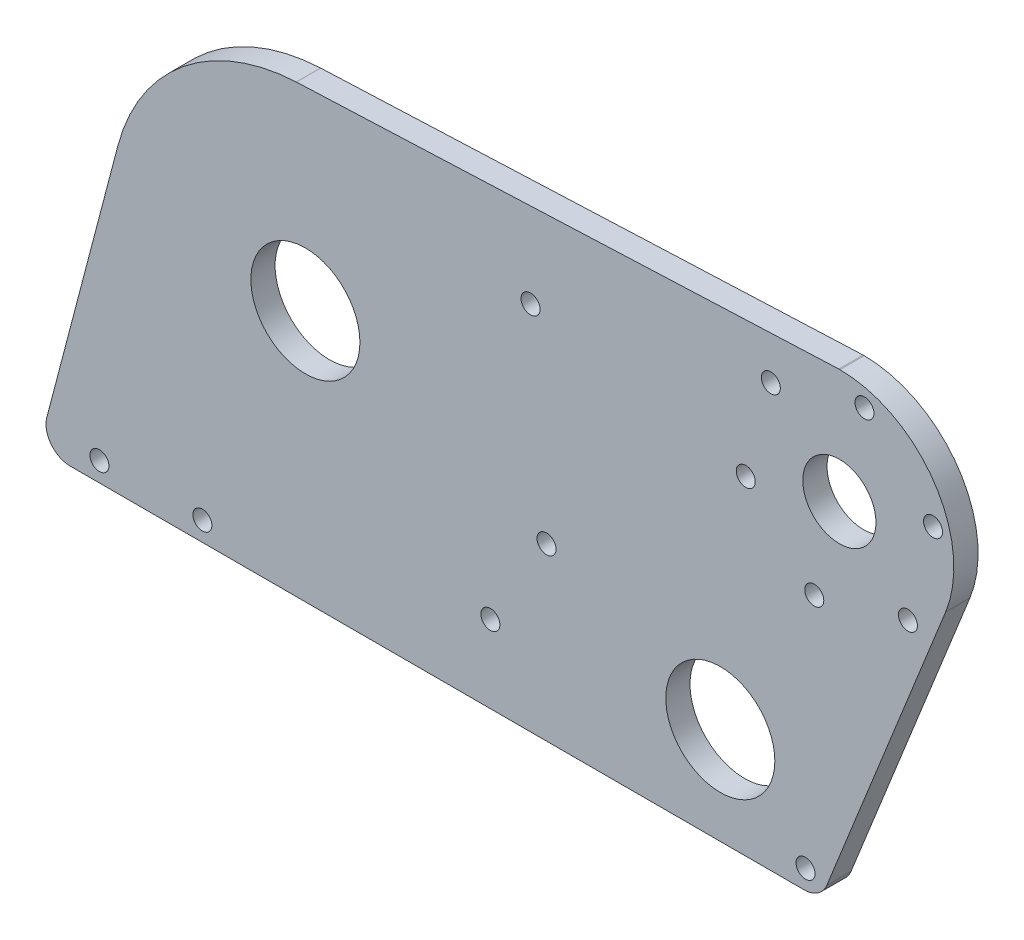
ISO-10303-21;
HEADER;
FILE_DESCRIPTION(('STEP AP214'),'2;1');
FILE_NAME('part.step','',(''),(''),'','','');
FILE_SCHEMA(('AUTOMOTIVE_DESIGN { 1 0 10303 214 1 1 1 1 }'));
ENDSEC;
DATA;
#1=APPLICATION_CONTEXT('core data for automotive mechanical design processes');
#2=APPLICATION_PROTOCOL_DEFINITION('international standard','automotive_design',2000,#1);
#3=PRODUCT_CONTEXT('',#1,'mechanical');
#4=PRODUCT('Part','Part','',(#3));
#5=PRODUCT_RELATED_PRODUCT_CATEGORY('part','',(#4));
#6=PRODUCT_DEFINITION_FORMATION('','',#4);
#7=PRODUCT_DEFINITION_CONTEXT('part definition',#1,'design');
#8=PRODUCT_DEFINITION('design','',#6,#7);
#9=PRODUCT_DEFINITION_SHAPE('','',#8);
#10=(LENGTH_UNIT() NAMED_UNIT(*) SI_UNIT(.MILLI.,.METRE.));
#11=(NAMED_UNIT(*) PLANE_ANGLE_UNIT() SI_UNIT($,.RADIAN.));
#12=(NAMED_UNIT(*) SI_UNIT($,.STERADIAN.) SOLID_ANGLE_UNIT());
#13=UNCERTAINTY_MEASURE_WITH_UNIT(LENGTH_MEASURE(1.E-05),#10,'distance_accuracy_value','');
#14=(GEOMETRIC_REPRESENTATION_CONTEXT(3) GLOBAL_UNCERTAINTY_ASSIGNED_CONTEXT((#13)) GLOBAL_UNIT_ASSIGNED_CONTEXT((#10,
#11,#12)) REPRESENTATION_CONTEXT('',''));
#15=CARTESIAN_POINT('',(0.,0.,0.));
#16=DIRECTION('',(0.,0.,1.));
#17=DIRECTION('',(1.,0.,0.));
#18=AXIS2_PLACEMENT_3D('',#15,#16,#17);
#19=CARTESIAN_POINT('',(158.75,220.726,3.175));
#20=DIRECTION('',(0.,0.,1.));
#21=DIRECTION('',(1.,0.,0.));
#22=AXIS2_PLACEMENT_3D('',#19,#20,#21);
#23=PLANE('',#22);
#24=CARTESIAN_POINT('',(217.742898667521,251.796782606874,3.175));
#25=DIRECTION('',(0.,0.,1.));
#26=DIRECTION('',(1.,0.,0.));
#27=AXIS2_PLACEMENT_3D('',#24,#25,#26);
#28=CIRCLE('',#27,2.48920000000001);
#29=CARTESIAN_POINT('',(220.232098667521,251.796782606874,3.175));
#30=VERTEX_POINT('',#29);
#31=EDGE_CURVE('E368',#30,#30,#28,.T.);
#32=ORIENTED_EDGE('',*,*,#31,.F.);
#33=EDGE_LOOP('',(#32));
#34=FACE_BOUND('',#33,.T.);
#35=CARTESIAN_POINT('',(274.137564206942,240.860121402947,3.175));
#36=DIRECTION('',(0.,0.,1.));
#37=DIRECTION('',(1.,0.,0.));
#38=AXIS2_PLACEMENT_3D('',#35,#36,#37);
#39=CIRCLE('',#38,2.48920000000001);
#40=CARTESIAN_POINT('',(276.626764206942,240.860121402947,3.175));
#41=VERTEX_POINT('',#40);
#42=EDGE_CURVE('E348',#41,#41,#39,.T.);
#43=ORIENTED_EDGE('',*,*,#42,.F.);
#44=EDGE_LOOP('',(#43));
#45=FACE_BOUND('',#44,.T.);
#46=CARTESIAN_POINT('',(316.632592436823,229.473612906414,3.175));
#47=DIRECTION('',(0.,0.,1.));
#48=DIRECTION('',(1.,0.,0.));
#49=AXIS2_PLACEMENT_3D('',#46,#47,#48);
#50=CIRCLE('',#49,2.48920000000001);
#51=CARTESIAN_POINT('',(319.121792436823,229.473612906414,3.175));
#52=VERTEX_POINT('',#51);
#53=EDGE_CURVE('E332',#52,#52,#50,.T.);
#54=ORIENTED_EDGE('',*,*,#53,.F.);
#55=EDGE_LOOP('',(#54));
#56=FACE_BOUND('',#55,.T.);
#57=CARTESIAN_POINT('',(305.246083940288,271.968641136294,3.175));
#58=DIRECTION('',(0.,0.,1.));
#59=DIRECTION('',(1.,0.,0.));
#60=AXIS2_PLACEMENT_3D('',#57,#58,#59);
#61=CIRCLE('',#60,2.48920000000001);
#62=CARTESIAN_POINT('',(307.735283940288,271.968641136294,3.175));
#63=VERTEX_POINT('',#62);
#64=EDGE_CURVE('E316',#63,#63,#61,.T.);
#65=ORIENTED_EDGE('',*,*,#64,.F.);
#66=EDGE_LOOP('',(#65));
#67=FACE_BOUND('',#66,.T.);
#68=CARTESIAN_POINT('',(104.775,159.766,3.175));
#69=DIRECTION('',(0.,0.,1.));
#70=DIRECTION('',(1.,0.,0.));
#71=AXIS2_PLACEMENT_3D('',#68,#69,#70);
#72=CIRCLE('',#71,2.48920000000002);
#73=CARTESIAN_POINT('',(107.2642,159.766,3.175));
#74=VERTEX_POINT('',#73);
#75=EDGE_CURVE('E300',#74,#74,#72,.T.);
#76=ORIENTED_EDGE('',*,*,#75,.F.);
#77=EDGE_LOOP('',(#76));
#78=FACE_BOUND('',#77,.T.);
#79=CARTESIAN_POINT('',(289.807138511617,159.766,3.175));
#80=DIRECTION('',(0.,0.,1.));
#81=DIRECTION('',(1.,0.,0.));
#82=AXIS2_PLACEMENT_3D('',#79,#80,#81);
#83=CIRCLE('',#82,2.48920000000001);
#84=CARTESIAN_POINT('',(292.296338511617,159.766,3.175));
#85=VERTEX_POINT('',#84);
#86=EDGE_CURVE('E284',#85,#85,#83,.T.);
#87=ORIENTED_EDGE('',*,*,#86,.F.);
#88=EDGE_LOOP('',(#87));
#89=FACE_BOUND('',#88,.T.);
#90=CARTESIAN_POINT('',(207.227757220364,174.949776041667,3.175));
#91=DIRECTION('',(0.,0.,1.));
#92=DIRECTION('',(1.,0.,0.));
#93=AXIS2_PLACEMENT_3D('',#90,#91,#92);
#94=CIRCLE('',#93,2.48920000000001);
#95=CARTESIAN_POINT('',(209.716957220364,174.949776041667,3.175));
#96=VERTEX_POINT('',#95);
#97=EDGE_CURVE('E268',#96,#96,#94,.T.);
#98=ORIENTED_EDGE('',*,*,#97,.F.);
#99=EDGE_LOOP('',(#98));
#100=FACE_BOUND('',#99,.T.);
#101=CARTESIAN_POINT('',(158.75,220.726,3.175));
#102=DIRECTION('',(0.,0.,1.));
#103=DIRECTION('',(1.,0.,0.));
#104=AXIS2_PLACEMENT_3D('',#101,#102,#103);
#105=CIRCLE('',#104,14.2875);
#106=CARTESIAN_POINT('',(173.0375,220.726,3.175));
#107=VERTEX_POINT('',#106);
#108=EDGE_CURVE('E245',#107,#107,#105,.T.);
#109=ORIENTED_EDGE('',*,*,#108,.F.);
#110=EDGE_LOOP('',(#109));
#111=FACE_BOUND('',#110,.T.);
#112=DIRECTION('',(-0.999123701760337,-0.0418548513403403,0.));
#113=VECTOR('',#112,1.);
#114=CARTESIAN_POINT('',(156.380494559322,271.470708531694,3.175));
#115=LINE('',#114,#113);
#116=CARTESIAN_POINT('',(298.531355986203,277.42562999181,3.175));
#117=VERTEX_POINT('',#116);
#118=CARTESIAN_POINT('',(156.396208563172,271.471366815843,3.175));
#119=VERTEX_POINT('',#118);
#120=EDGE_CURVE('E160',#117,#119,#115,.T.);
#121=ORIENTED_EDGE('',*,*,#120,.T.);
#122=CARTESIAN_POINT('',(156.661986869184,265.126931309664,3.175));
#123=DIRECTION('',(0.,0.,1.));
#124=DIRECTION('',(1.,0.,0.));
#125=AXIS2_PLACEMENT_3D('',#122,#123,#124);
#126=CIRCLE('',#125,6.35);
#127=CARTESIAN_POINT('',(156.363699279067,271.469921496759,3.175));
#128=VERTEX_POINT('',#127);
#129=EDGE_CURVE('E130',#119,#128,#126,.T.);
#130=ORIENTED_EDGE('',*,*,#129,.T.);
#131=CARTESIAN_POINT('',(158.75,220.726,3.175));
#132=DIRECTION('',(0.,0.,1.));
#133=DIRECTION('',(1.,0.,0.));
#134=AXIS2_PLACEMENT_3D('',#131,#132,#133);
#135=CIRCLE('',#134,50.8);
#136=CARTESIAN_POINT('',(109.613663592345,233.620201969635,3.175));
#137=VERTEX_POINT('',#136);
#138=EDGE_CURVE('E123',#128,#137,#135,.T.);
#139=ORIENTED_EDGE('',*,*,#138,.T.);
#140=DIRECTION('',(-0.253822873418016,-0.967250716686125,0.));
#141=VECTOR('',#140,1.);
#142=CARTESIAN_POINT('',(109.613663592345,233.620201969635,3.175));
#143=LINE('',#142,#141);
#144=CARTESIAN_POINT('',(90.9893038750322,162.647775246204,3.175));
#145=VERTEX_POINT('',#144);
#146=EDGE_CURVE('E127',#137,#145,#143,.T.);
#147=ORIENTED_EDGE('',*,*,#146,.T.);
#148=CARTESIAN_POINT('',(97.1313459259891,161.036,3.175));
#149=DIRECTION('',(0.,0.,1.));
#150=DIRECTION('',(1.,0.,0.));
#151=AXIS2_PLACEMENT_3D('',#148,#149,#150);
#152=CIRCLE('',#151,6.35);
#153=CARTESIAN_POINT('',(97.1313459259891,154.686,3.175));
#154=VERTEX_POINT('',#153);
#155=EDGE_CURVE('E182',#145,#154,#152,.T.);
#156=ORIENTED_EDGE('',*,*,#155,.T.);
#157=DIRECTION('',(1.,0.,0.));
#158=VECTOR('',#157,1.);
#159=CARTESIAN_POINT('',(88.9,154.686,3.175));
#160=LINE('',#159,#158);
#161=CARTESIAN_POINT('',(289.479676392396,154.686,3.175));
#162=VERTEX_POINT('',#161);
#163=EDGE_CURVE('E145',#154,#162,#160,.T.);
#164=ORIENTED_EDGE('',*,*,#163,.T.);
#165=CARTESIAN_POINT('',(289.479676392396,161.036,3.175));
#166=DIRECTION('',(0.,0.,1.));
#167=DIRECTION('',(1.,0.,0.));
#168=AXIS2_PLACEMENT_3D('',#165,#166,#167);
#169=CIRCLE('',#168,6.35);
#170=CARTESIAN_POINT('',(295.372823819104,158.670981309358,3.175));
#171=VERTEX_POINT('',#170);
#172=EDGE_CURVE('E68',#162,#171,#169,.T.);
#173=ORIENTED_EDGE('',*,*,#172,.T.);
#174=DIRECTION('',(0.37244388829002,0.92805471286741,0.));
#175=VECTOR('',#174,1.);
#176=CARTESIAN_POINT('',(293.773584126613,154.686,3.175));
#177=LINE('',#176,#175);
#178=CARTESIAN_POINT('',(326.511308638453,236.261776853961,3.175));
#179=VERTEX_POINT('',#178);
#180=EDGE_CURVE('E212',#171,#179,#177,.T.);
#181=ORIENTED_EDGE('',*,*,#180,.T.);
#182=CARTESIAN_POINT('',(298.672080194684,247.434125148552,3.175));
#183=DIRECTION('',(0.,0.,1.));
#184=DIRECTION('',(1.,0.,0.));
#185=AXIS2_PLACEMENT_3D('',#182,#183,#184);
#186=CIRCLE('',#185,29.9974);
#187=CARTESIAN_POINT('',(298.830714876943,277.431105693226,3.175));
#188=VERTEX_POINT('',#187);
#189=EDGE_CURVE('E255',#179,#188,#186,.T.);
#190=ORIENTED_EDGE('',*,*,#189,.T.);
#191=CARTESIAN_POINT('',(298.797134292214,271.081194485632,3.175));
#192=DIRECTION('',(0.,0.,1.));
#193=DIRECTION('',(1.,0.,0.));
#194=AXIS2_PLACEMENT_3D('',#191,#192,#193);
#195=CIRCLE('',#194,6.35);
#196=EDGE_CURVE('E187',#188,#117,#195,.T.);
#197=ORIENTED_EDGE('',*,*,#196,.T.);
#198=EDGE_LOOP('',(#121,#130,#139,#147,#156,#164,#173,#181,#190,#197));
#199=FACE_BOUND('',#198,.T.);
#200=CARTESIAN_POINT('',(221.938385064048,199.447287210041,3.175));
#201=DIRECTION('',(0.,0.,1.));
#202=DIRECTION('',(1.,0.,0.));
#203=AXIS2_PLACEMENT_3D('',#200,#201,#202);
#204=CIRCLE('',#203,2.48920000000001);
#205=CARTESIAN_POINT('',(224.427585064048,199.447287210041,3.175));
#206=VERTEX_POINT('',#205);
#207=EDGE_CURVE('E262',#206,#206,#204,.T.);
#208=ORIENTED_EDGE('',*,*,#207,.F.);
#209=EDGE_LOOP('',(#208));
#210=FACE_BOUND('',#209,.T.);
#211=CARTESIAN_POINT('',(267.470439119172,180.086,3.175));
#212=DIRECTION('',(0.,0.,1.));
#213=DIRECTION('',(1.,0.,0.));
#214=AXIS2_PLACEMENT_3D('',#211,#212,#213);
#215=CIRCLE('',#214,14.2875000000001);
#216=CARTESIAN_POINT('',(281.757939119172,180.086,3.175));
#217=VERTEX_POINT('',#216);
#218=EDGE_CURVE('E276',#217,#217,#215,.T.);
#219=ORIENTED_EDGE('',*,*,#218,.F.);
#220=EDGE_LOOP('',(#219));
#221=FACE_BOUND('',#220,.T.);
#222=CARTESIAN_POINT('',(131.7625,159.766,3.175));
#223=DIRECTION('',(0.,0.,1.));
#224=DIRECTION('',(1.,0.,0.));
#225=AXIS2_PLACEMENT_3D('',#222,#223,#224);
#226=CIRCLE('',#225,2.48920000000001);
#227=CARTESIAN_POINT('',(134.2517,159.766,3.175));
#228=VERTEX_POINT('',#227);
#229=EDGE_CURVE('E292',#228,#228,#226,.T.);
#230=ORIENTED_EDGE('',*,*,#229,.F.);
#231=EDGE_LOOP('',(#230));
#232=FACE_BOUND('',#231,.T.);
#233=CARTESIAN_POINT('',(298.672080194684,247.434125148552,3.175));
#234=DIRECTION('',(0.,0.,1.));
#235=DIRECTION('',(1.,0.,0.));
#236=AXIS2_PLACEMENT_3D('',#233,#234,#235);
#237=CIRCLE('',#236,9.58850000000001);
#238=CARTESIAN_POINT('',(308.260580194684,247.434125148552,3.175));
#239=VERTEX_POINT('',#238);
#240=EDGE_CURVE('E308',#239,#239,#237,.T.);
#241=ORIENTED_EDGE('',*,*,#240,.F.);
#242=EDGE_LOOP('',(#241));
#243=FACE_BOUND('',#242,.T.);
#244=CARTESIAN_POINT('',(323.206596182427,254.008128894156,3.175));
#245=DIRECTION('',(0.,0.,1.));
#246=DIRECTION('',(1.,0.,0.));
#247=AXIS2_PLACEMENT_3D('',#244,#245,#246);
#248=CIRCLE('',#247,2.48920000000001);
#249=CARTESIAN_POINT('',(325.695796182427,254.008128894156,3.175));
#250=VERTEX_POINT('',#249);
#251=EDGE_CURVE('E324',#250,#250,#248,.T.);
#252=ORIENTED_EDGE('',*,*,#251,.F.);
#253=EDGE_LOOP('',(#252));
#254=FACE_BOUND('',#253,.T.);
#255=CARTESIAN_POINT('',(292.098076449081,222.899609160809,3.175));
#256=DIRECTION('',(0.,0.,1.));
#257=DIRECTION('',(1.,0.,0.));
#258=AXIS2_PLACEMENT_3D('',#255,#256,#257);
#259=CIRCLE('',#258,2.48920000000001);
#260=CARTESIAN_POINT('',(294.587276449081,222.899609160809,3.175));
#261=VERTEX_POINT('',#260);
#262=EDGE_CURVE('E340',#261,#261,#259,.T.);
#263=ORIENTED_EDGE('',*,*,#262,.F.);
#264=EDGE_LOOP('',(#263));
#265=FACE_BOUND('',#264,.T.);
#266=CARTESIAN_POINT('',(280.711567952546,265.39463739069,3.175));
#267=DIRECTION('',(0.,0.,1.));
#268=DIRECTION('',(1.,0.,0.));
#269=AXIS2_PLACEMENT_3D('',#266,#267,#268);
#270=CIRCLE('',#269,2.48919999999999);
#271=CARTESIAN_POINT('',(283.200767952546,265.39463739069,3.175));
#272=VERTEX_POINT('',#271);
#273=EDGE_CURVE('E356',#272,#272,#270,.T.);
#274=ORIENTED_EDGE('',*,*,#273,.F.);
#275=EDGE_LOOP('',(#274));
#276=FACE_BOUND('',#275,.T.);
#277=ADVANCED_FACE('F44',(#34,#45,#56,#67,#78,#89,#100,#111,#199,#210,#221,#232,#243,#254,#265,
#276),#23,.T.);
#278=CARTESIAN_POINT('',(158.75,220.726,-3.175));
#279=DIRECTION('',(0.,0.,1.));
#280=DIRECTION('',(1.,0.,0.));
#281=AXIS2_PLACEMENT_3D('',#278,#279,#280);
#282=PLANE('',#281);
#283=CARTESIAN_POINT('',(217.742898667521,251.796782606874,-3.175));
#284=DIRECTION('',(0.,0.,1.));
#285=DIRECTION('',(1.,0.,0.));
#286=AXIS2_PLACEMENT_3D('',#283,#284,#285);
#287=CIRCLE('',#286,2.48920000000001);
#288=CARTESIAN_POINT('',(220.232098667521,251.796782606874,-3.175));
#289=VERTEX_POINT('',#288);
#290=EDGE_CURVE('E364',#289,#289,#287,.T.);
#291=ORIENTED_EDGE('',*,*,#290,.T.);
#292=EDGE_LOOP('',(#291));
#293=FACE_BOUND('',#292,.T.);
#294=CARTESIAN_POINT('',(158.75,220.726,-3.175));
#295=DIRECTION('',(0.,0.,1.));
#296=DIRECTION('',(1.,0.,0.));
#297=AXIS2_PLACEMENT_3D('',#294,#295,#296);
#298=CIRCLE('',#297,50.8);
#299=CARTESIAN_POINT('',(156.363699279067,271.469921496759,-3.175));
#300=VERTEX_POINT('',#299);
#301=CARTESIAN_POINT('',(109.613663592345,233.620201969635,-3.175));
#302=VERTEX_POINT('',#301);
#303=EDGE_CURVE('E149',#300,#302,#298,.T.);
#304=ORIENTED_EDGE('',*,*,#303,.F.);
#305=CARTESIAN_POINT('',(156.661986869184,265.126931309664,-3.175));
#306=DIRECTION('',(0.,0.,1.));
#307=DIRECTION('',(1.,0.,0.));
#308=AXIS2_PLACEMENT_3D('',#305,#306,#307);
#309=CIRCLE('',#308,6.35);
#310=CARTESIAN_POINT('',(156.396208563172,271.471366815843,-3.175));
#311=VERTEX_POINT('',#310);
#312=EDGE_CURVE('E172',#300,#311,#309,.F.);
#313=ORIENTED_EDGE('',*,*,#312,.T.);
#314=DIRECTION('',(-0.999123701760337,-0.0418548513403403,0.));
#315=VECTOR('',#314,1.);
#316=CARTESIAN_POINT('',(156.380494559322,271.470708531694,-3.175));
#317=LINE('',#316,#315);
#318=CARTESIAN_POINT('',(298.531355986203,277.42562999181,-3.175));
#319=VERTEX_POINT('',#318);
#320=EDGE_CURVE('E136',#319,#311,#317,.T.);
#321=ORIENTED_EDGE('',*,*,#320,.F.);
#322=CARTESIAN_POINT('',(298.797134292214,271.081194485632,-3.175));
#323=DIRECTION('',(0.,0.,1.));
#324=DIRECTION('',(1.,0.,0.));
#325=AXIS2_PLACEMENT_3D('',#322,#323,#324);
#326=CIRCLE('',#325,6.35);
#327=CARTESIAN_POINT('',(298.830714876943,277.431105693226,-3.175));
#328=VERTEX_POINT('',#327);
#329=EDGE_CURVE('E169',#319,#328,#326,.F.);
#330=ORIENTED_EDGE('',*,*,#329,.T.);
#331=CARTESIAN_POINT('',(298.672080194684,247.434125148552,-3.175));
#332=DIRECTION('',(0.,0.,1.));
#333=DIRECTION('',(1.,0.,0.));
#334=AXIS2_PLACEMENT_3D('',#331,#332,#333);
#335=CIRCLE('',#334,29.9974);
#336=CARTESIAN_POINT('',(326.511308638453,236.261776853961,-3.175));
#337=VERTEX_POINT('',#336);
#338=EDGE_CURVE('E225',#337,#328,#335,.T.);
#339=ORIENTED_EDGE('',*,*,#338,.F.);
#340=DIRECTION('',(0.37244388829002,0.92805471286741,0.));
#341=VECTOR('',#340,1.);
#342=CARTESIAN_POINT('',(293.773584126613,154.686,-3.175));
#343=LINE('',#342,#341);
#344=CARTESIAN_POINT('',(295.372823819104,158.670981309358,-3.175));
#345=VERTEX_POINT('',#344);
#346=EDGE_CURVE('E220',#345,#337,#343,.T.);
#347=ORIENTED_EDGE('',*,*,#346,.F.);
#348=CARTESIAN_POINT('',(289.479676392396,161.036,-3.175));
#349=DIRECTION('',(0.,0.,1.));
#350=DIRECTION('',(1.,0.,0.));
#351=AXIS2_PLACEMENT_3D('',#348,#349,#350);
#352=CIRCLE('',#351,6.35);
#353=CARTESIAN_POINT('',(289.479676392396,154.686,-3.175));
#354=VERTEX_POINT('',#353);
#355=EDGE_CURVE('E166',#345,#354,#352,.F.);
#356=ORIENTED_EDGE('',*,*,#355,.T.);
#357=DIRECTION('',(1.,0.,0.));
#358=VECTOR('',#357,1.);
#359=CARTESIAN_POINT('',(88.9,154.686,-3.175));
#360=LINE('',#359,#358);
#361=CARTESIAN_POINT('',(97.1313459259891,154.686,-3.175));
#362=VERTEX_POINT('',#361);
#363=EDGE_CURVE('E209',#362,#354,#360,.T.);
#364=ORIENTED_EDGE('',*,*,#363,.F.);
#365=CARTESIAN_POINT('',(97.1313459259891,161.036,-3.175));
#366=DIRECTION('',(0.,0.,1.));
#367=DIRECTION('',(1.,0.,0.));
#368=AXIS2_PLACEMENT_3D('',#365,#366,#367);
#369=CIRCLE('',#368,6.35);
#370=CARTESIAN_POINT('',(90.9893038750322,162.647775246204,-3.175));
#371=VERTEX_POINT('',#370);
#372=EDGE_CURVE('E157',#362,#371,#369,.F.);
#373=ORIENTED_EDGE('',*,*,#372,.T.);
#374=DIRECTION('',(-0.253822873418016,-0.967250716686125,0.));
#375=VECTOR('',#374,1.);
#376=CARTESIAN_POINT('',(109.613663592345,233.620201969635,-3.175));
#377=LINE('',#376,#375);
#378=EDGE_CURVE('E231',#302,#371,#377,.T.);
#379=ORIENTED_EDGE('',*,*,#378,.F.);
#380=EDGE_LOOP('',(#304,#313,#321,#330,#339,#347,#356,#364,#373,#379));
#381=FACE_BOUND('',#380,.T.);
#382=CARTESIAN_POINT('',(158.75,220.726,-3.175));
#383=DIRECTION('',(0.,0.,1.));
#384=DIRECTION('',(1.,0.,0.));
#385=AXIS2_PLACEMENT_3D('',#382,#383,#384);
#386=CIRCLE('',#385,14.2875);
#387=CARTESIAN_POINT('',(173.0375,220.726,-3.175));
#388=VERTEX_POINT('',#387);
#389=EDGE_CURVE('E250',#388,#388,#386,.T.);
#390=ORIENTED_EDGE('',*,*,#389,.T.);
#391=EDGE_LOOP('',(#390));
#392=FACE_BOUND('',#391,.T.);
#393=CARTESIAN_POINT('',(221.938385064048,199.447287210041,-3.175));
#394=DIRECTION('',(0.,0.,1.));
#395=DIRECTION('',(1.,0.,0.));
#396=AXIS2_PLACEMENT_3D('',#393,#394,#395);
#397=CIRCLE('',#396,2.48920000000001);
#398=CARTESIAN_POINT('',(224.427585064048,199.447287210041,-3.175));
#399=VERTEX_POINT('',#398);
#400=EDGE_CURVE('E264',#399,#399,#397,.T.);
#401=ORIENTED_EDGE('',*,*,#400,.T.);
#402=EDGE_LOOP('',(#401));
#403=FACE_BOUND('',#402,.T.);
#404=CARTESIAN_POINT('',(207.227757220364,174.949776041667,-3.175));
#405=DIRECTION('',(0.,0.,1.));
#406=DIRECTION('',(1.,0.,0.));
#407=AXIS2_PLACEMENT_3D('',#404,#405,#406);
#408=CIRCLE('',#407,2.48920000000001);
#409=CARTESIAN_POINT('',(209.716957220364,174.949776041667,-3.175));
#410=VERTEX_POINT('',#409);
#411=EDGE_CURVE('E272',#410,#410,#408,.T.);
#412=ORIENTED_EDGE('',*,*,#411,.T.);
#413=EDGE_LOOP('',(#412));
#414=FACE_BOUND('',#413,.T.);
#415=CARTESIAN_POINT('',(267.470439119172,180.086,-3.175));
#416=DIRECTION('',(0.,0.,1.));
#417=DIRECTION('',(1.,0.,0.));
#418=AXIS2_PLACEMENT_3D('',#415,#416,#417);
#419=CIRCLE('',#418,14.2875000000001);
#420=CARTESIAN_POINT('',(281.757939119172,180.086,-3.175));
#421=VERTEX_POINT('',#420);
#422=EDGE_CURVE('E280',#421,#421,#419,.T.);
#423=ORIENTED_EDGE('',*,*,#422,.T.);
#424=EDGE_LOOP('',(#423));
#425=FACE_BOUND('',#424,.T.);
#426=CARTESIAN_POINT('',(289.807138511617,159.766,-3.175));
#427=DIRECTION('',(0.,0.,1.));
#428=DIRECTION('',(1.,0.,0.));
#429=AXIS2_PLACEMENT_3D('',#426,#427,#428);
#430=CIRCLE('',#429,2.48920000000001);
#431=CARTESIAN_POINT('',(292.296338511617,159.766,-3.175));
#432=VERTEX_POINT('',#431);
#433=EDGE_CURVE('E288',#432,#432,#430,.T.);
#434=ORIENTED_EDGE('',*,*,#433,.T.);
#435=EDGE_LOOP('',(#434));
#436=FACE_BOUND('',#435,.T.);
#437=CARTESIAN_POINT('',(131.7625,159.766,-3.175));
#438=DIRECTION('',(0.,0.,1.));
#439=DIRECTION('',(1.,0.,0.));
#440=AXIS2_PLACEMENT_3D('',#437,#438,#439);
#441=CIRCLE('',#440,2.48920000000001);
#442=CARTESIAN_POINT('',(134.2517,159.766,-3.175));
#443=VERTEX_POINT('',#442);
#444=EDGE_CURVE('E296',#443,#443,#441,.T.);
#445=ORIENTED_EDGE('',*,*,#444,.T.);
#446=EDGE_LOOP('',(#445));
#447=FACE_BOUND('',#446,.T.);
#448=CARTESIAN_POINT('',(104.775,159.766,-3.175));
#449=DIRECTION('',(0.,0.,1.));
#450=DIRECTION('',(1.,0.,0.));
#451=AXIS2_PLACEMENT_3D('',#448,#449,#450);
#452=CIRCLE('',#451,2.48920000000002);
#453=CARTESIAN_POINT('',(107.2642,159.766,-3.175));
#454=VERTEX_POINT('',#453);
#455=EDGE_CURVE('E304',#454,#454,#452,.T.);
#456=ORIENTED_EDGE('',*,*,#455,.T.);
#457=EDGE_LOOP('',(#456));
#458=FACE_BOUND('',#457,.T.);
#459=CARTESIAN_POINT('',(298.672080194684,247.434125148552,-3.175));
#460=DIRECTION('',(0.,0.,1.));
#461=DIRECTION('',(1.,0.,0.));
#462=AXIS2_PLACEMENT_3D('',#459,#460,#461);
#463=CIRCLE('',#462,9.58850000000001);
#464=CARTESIAN_POINT('',(308.260580194684,247.434125148552,-3.175));
#465=VERTEX_POINT('',#464);
#466=EDGE_CURVE('E312',#465,#465,#463,.T.);
#467=ORIENTED_EDGE('',*,*,#466,.T.);
#468=EDGE_LOOP('',(#467));
#469=FACE_BOUND('',#468,.T.);
#470=CARTESIAN_POINT('',(305.246083940288,271.968641136294,-3.175));
#471=DIRECTION('',(0.,0.,1.));
#472=DIRECTION('',(1.,0.,0.));
#473=AXIS2_PLACEMENT_3D('',#470,#471,#472);
#474=CIRCLE('',#473,2.48920000000001);
#475=CARTESIAN_POINT('',(307.735283940288,271.968641136294,-3.175));
#476=VERTEX_POINT('',#475);
#477=EDGE_CURVE('E320',#476,#476,#474,.T.);
#478=ORIENTED_EDGE('',*,*,#477,.T.);
#479=EDGE_LOOP('',(#478));
#480=FACE_BOUND('',#479,.T.);
#481=CARTESIAN_POINT('',(323.206596182427,254.008128894156,-3.175));
#482=DIRECTION('',(0.,0.,1.));
#483=DIRECTION('',(1.,0.,0.));
#484=AXIS2_PLACEMENT_3D('',#481,#482,#483);
#485=CIRCLE('',#484,2.48920000000001);
#486=CARTESIAN_POINT('',(325.695796182427,254.008128894156,-3.175));
#487=VERTEX_POINT('',#486);
#488=EDGE_CURVE('E328',#487,#487,#485,.T.);
#489=ORIENTED_EDGE('',*,*,#488,.T.);
#490=EDGE_LOOP('',(#489));
#491=FACE_BOUND('',#490,.T.);
#492=CARTESIAN_POINT('',(316.632592436823,229.473612906414,-3.175));
#493=DIRECTION('',(0.,0.,1.));
#494=DIRECTION('',(1.,0.,0.));
#495=AXIS2_PLACEMENT_3D('',#492,#493,#494);
#496=CIRCLE('',#495,2.48920000000001);
#497=CARTESIAN_POINT('',(319.121792436823,229.473612906414,-3.175));
#498=VERTEX_POINT('',#497);
#499=EDGE_CURVE('E336',#498,#498,#496,.T.);
#500=ORIENTED_EDGE('',*,*,#499,.T.);
#501=EDGE_LOOP('',(#500));
#502=FACE_BOUND('',#501,.T.);
#503=CARTESIAN_POINT('',(292.098076449081,222.899609160809,-3.175));
#504=DIRECTION('',(0.,0.,1.));
#505=DIRECTION('',(1.,0.,0.));
#506=AXIS2_PLACEMENT_3D('',#503,#504,#505);
#507=CIRCLE('',#506,2.48920000000001);
#508=CARTESIAN_POINT('',(294.587276449081,222.899609160809,-3.175));
#509=VERTEX_POINT('',#508);
#510=EDGE_CURVE('E344',#509,#509,#507,.T.);
#511=ORIENTED_EDGE('',*,*,#510,.T.);
#512=EDGE_LOOP('',(#511));
#513=FACE_BOUND('',#512,.T.);
#514=CARTESIAN_POINT('',(274.137564206942,240.860121402947,-3.175));
#515=DIRECTION('',(0.,0.,1.));
#516=DIRECTION('',(1.,0.,0.));
#517=AXIS2_PLACEMENT_3D('',#514,#515,#516);
#518=CIRCLE('',#517,2.48920000000001);
#519=CARTESIAN_POINT('',(276.626764206942,240.860121402947,-3.175));
#520=VERTEX_POINT('',#519);
#521=EDGE_CURVE('E352',#520,#520,#518,.T.);
#522=ORIENTED_EDGE('',*,*,#521,.T.);
#523=EDGE_LOOP('',(#522));
#524=FACE_BOUND('',#523,.T.);
#525=CARTESIAN_POINT('',(280.711567952546,265.39463739069,-3.175));
#526=DIRECTION('',(0.,0.,1.));
#527=DIRECTION('',(1.,0.,0.));
#528=AXIS2_PLACEMENT_3D('',#525,#526,#527);
#529=CIRCLE('',#528,2.48919999999999);
#530=CARTESIAN_POINT('',(283.200767952546,265.39463739069,-3.175));
#531=VERTEX_POINT('',#530);
#532=EDGE_CURVE('E360',#531,#531,#529,.T.);
#533=ORIENTED_EDGE('',*,*,#532,.T.);
#534=EDGE_LOOP('',(#533));
#535=FACE_BOUND('',#534,.T.);
#536=ADVANCED_FACE('F223',(#293,#381,#392,#403,#414,#425,#436,#447,#458,#469,#480,#491,#502,
#513,#524,#535),#282,.F.);
#537=CARTESIAN_POINT('',(158.75,220.726,3.175));
#538=DIRECTION('',(0.,0.,-1.));
#539=DIRECTION('',(-1.,0.,0.));
#540=AXIS2_PLACEMENT_3D('',#537,#538,#539);
#541=CYLINDRICAL_SURFACE('',#540,50.8);
#542=ORIENTED_EDGE('',*,*,#138,.F.);
#543=DIRECTION('',(0.,0.,-1.));
#544=VECTOR('',#543,1.);
#545=CARTESIAN_POINT('',(156.363699279067,271.469921496759,3.175));
#546=LINE('',#545,#544);
#547=EDGE_CURVE('E152',#128,#300,#546,.T.);
#548=ORIENTED_EDGE('',*,*,#547,.T.);
#549=ORIENTED_EDGE('',*,*,#303,.T.);
#550=DIRECTION('',(0.,0.,-1.));
#551=VECTOR('',#550,1.);
#552=CARTESIAN_POINT('',(109.613663592345,233.620201969635,3.175));
#553=LINE('',#552,#551);
#554=EDGE_CURVE('E142',#137,#302,#553,.T.);
#555=ORIENTED_EDGE('',*,*,#554,.F.);
#556=EDGE_LOOP('',(#542,#548,#549,#555));
#557=FACE_BOUND('',#556,.T.);
#558=ADVANCED_FACE('F147',(#557),#541,.T.);
#559=CARTESIAN_POINT('',(109.613663592345,233.620201969635,3.175));
#560=DIRECTION('',(0.967250716686125,-0.253822873418016,0.));
#561=DIRECTION('',(0.253822873418016,0.967250716686125,0.));
#562=AXIS2_PLACEMENT_3D('',#559,#560,#561);
#563=PLANE('',#562);
#564=ORIENTED_EDGE('',*,*,#378,.T.);
#565=DIRECTION('',(0.,0.,-1.));
#566=VECTOR('',#565,1.);
#567=CARTESIAN_POINT('',(90.9893038750322,162.647775246204,3.175));
#568=LINE('',#567,#566);
#569=EDGE_CURVE('E11',#371,#145,#568,.F.);
#570=ORIENTED_EDGE('',*,*,#569,.T.);
#571=ORIENTED_EDGE('',*,*,#146,.F.);
#572=ORIENTED_EDGE('',*,*,#554,.T.);
#573=EDGE_LOOP('',(#564,#570,#571,#572));
#574=FACE_BOUND('',#573,.T.);
#575=ADVANCED_FACE('F141',(#574),#563,.F.);
#576=CARTESIAN_POINT('',(88.9,154.686,3.175));
#577=DIRECTION('',(0.,1.,0.));
#578=DIRECTION('',(0.,0.,1.));
#579=AXIS2_PLACEMENT_3D('',#576,#577,#578);
#580=PLANE('',#579);
#581=ORIENTED_EDGE('',*,*,#363,.T.);
#582=DIRECTION('',(0.,0.,-1.));
#583=VECTOR('',#582,1.);
#584=CARTESIAN_POINT('',(289.479676392396,154.686,3.175));
#585=LINE('',#584,#583);
#586=EDGE_CURVE('E53',#354,#162,#585,.F.);
#587=ORIENTED_EDGE('',*,*,#586,.T.);
#588=ORIENTED_EDGE('',*,*,#163,.F.);
#589=DIRECTION('',(0.,0.,-1.));
#590=VECTOR('',#589,1.);
#591=CARTESIAN_POINT('',(97.1313459259891,154.686,3.175));
#592=LINE('',#591,#590);
#593=EDGE_CURVE('E198',#154,#362,#592,.T.);
#594=ORIENTED_EDGE('',*,*,#593,.T.);
#595=EDGE_LOOP('',(#581,#587,#588,#594));
#596=FACE_BOUND('',#595,.T.);
#597=ADVANCED_FACE('F206',(#596),#580,.F.);
#598=CARTESIAN_POINT('',(293.773584126613,154.686,3.175));
#599=DIRECTION('',(-0.92805471286741,0.37244388829002,0.));
#600=DIRECTION('',(-0.37244388829002,-0.92805471286741,0.));
#601=AXIS2_PLACEMENT_3D('',#598,#599,#600);
#602=PLANE('',#601);
#603=ORIENTED_EDGE('',*,*,#180,.F.);
#604=DIRECTION('',(0.,0.,-1.));
#605=VECTOR('',#604,1.);
#606=CARTESIAN_POINT('',(295.372823819104,158.670981309358,3.175));
#607=LINE('',#606,#605);
#608=EDGE_CURVE('E194',#171,#345,#607,.T.);
#609=ORIENTED_EDGE('',*,*,#608,.T.);
#610=ORIENTED_EDGE('',*,*,#346,.T.);
#611=DIRECTION('',(0.,0.,-1.));
#612=VECTOR('',#611,1.);
#613=CARTESIAN_POINT('',(326.511308638453,236.261776853961,3.175));
#614=LINE('',#613,#612);
#615=EDGE_CURVE('E153',#179,#337,#614,.T.);
#616=ORIENTED_EDGE('',*,*,#615,.F.);
#617=EDGE_LOOP('',(#603,#609,#610,#616));
#618=FACE_BOUND('',#617,.T.);
#619=ADVANCED_FACE('F218',(#618),#602,.F.);
#620=CARTESIAN_POINT('',(298.672080194684,247.434125148552,3.175));
#621=DIRECTION('',(0.,0.,-1.));
#622=DIRECTION('',(-1.,0.,0.));
#623=AXIS2_PLACEMENT_3D('',#620,#621,#622);
#624=CYLINDRICAL_SURFACE('',#623,29.9974);
#625=ORIENTED_EDGE('',*,*,#338,.T.);
#626=DIRECTION('',(0.,0.,-1.));
#627=VECTOR('',#626,1.);
#628=CARTESIAN_POINT('',(298.830714876943,277.431105693226,3.175));
#629=LINE('',#628,#627);
#630=EDGE_CURVE('E60',#328,#188,#629,.F.);
#631=ORIENTED_EDGE('',*,*,#630,.T.);
#632=ORIENTED_EDGE('',*,*,#189,.F.);
#633=ORIENTED_EDGE('',*,*,#615,.T.);
#634=EDGE_LOOP('',(#625,#631,#632,#633));
#635=FACE_BOUND('',#634,.T.);
#636=ADVANCED_FACE('F495',(#635),#624,.T.);
#637=CARTESIAN_POINT('',(156.380494559322,271.470708531694,3.175));
#638=DIRECTION('',(0.0418548513403403,-0.999123701760337,0.));
#639=DIRECTION('',(0.999123701760337,0.0418548513403403,0.));
#640=AXIS2_PLACEMENT_3D('',#637,#638,#639);
#641=PLANE('',#640);
#642=ORIENTED_EDGE('',*,*,#320,.T.);
#643=DIRECTION('',(0.,0.,-1.));
#644=VECTOR('',#643,1.);
#645=CARTESIAN_POINT('',(156.396208563172,271.471366815843,3.175));
#646=LINE('',#645,#644);
#647=EDGE_CURVE('E179',#311,#119,#646,.F.);
#648=ORIENTED_EDGE('',*,*,#647,.T.);
#649=ORIENTED_EDGE('',*,*,#120,.F.);
#650=DIRECTION('',(0.,0.,-1.));
#651=VECTOR('',#650,1.);
#652=CARTESIAN_POINT('',(298.531355986203,277.42562999181,3.175));
#653=LINE('',#652,#651);
#654=EDGE_CURVE('E175',#117,#319,#653,.T.);
#655=ORIENTED_EDGE('',*,*,#654,.T.);
#656=EDGE_LOOP('',(#642,#648,#649,#655));
#657=FACE_BOUND('',#656,.T.);
#658=ADVANCED_FACE('F239',(#657),#641,.F.);
#659=CARTESIAN_POINT('',(158.75,220.726,3.175));
#660=DIRECTION('',(0.,0.,-1.));
#661=DIRECTION('',(-1.,0.,0.));
#662=AXIS2_PLACEMENT_3D('',#659,#660,#661);
#663=CYLINDRICAL_SURFACE('',#662,14.2875);
#664=ORIENTED_EDGE('',*,*,#108,.T.);
#665=EDGE_LOOP('',(#664));
#666=FACE_BOUND('',#665,.T.);
#667=ORIENTED_EDGE('',*,*,#389,.F.);
#668=EDGE_LOOP('',(#667));
#669=FACE_BOUND('',#668,.T.);
#670=ADVANCED_FACE('F400',(#666,#669),#663,.F.);
#671=CARTESIAN_POINT('',(221.938385064048,199.447287210041,3.175));
#672=DIRECTION('',(0.,0.,-1.));
#673=DIRECTION('',(-1.,0.,0.));
#674=AXIS2_PLACEMENT_3D('',#671,#672,#673);
#675=CYLINDRICAL_SURFACE('',#674,2.48920000000001);
#676=ORIENTED_EDGE('',*,*,#207,.T.);
#677=EDGE_LOOP('',(#676));
#678=FACE_BOUND('',#677,.T.);
#679=ORIENTED_EDGE('',*,*,#400,.F.);
#680=EDGE_LOOP('',(#679));
#681=FACE_BOUND('',#680,.T.);
#682=ADVANCED_FACE('F403',(#678,#681),#675,.F.);
#683=CARTESIAN_POINT('',(207.227757220364,174.949776041667,3.175));
#684=DIRECTION('',(0.,0.,-1.));
#685=DIRECTION('',(-1.,0.,0.));
#686=AXIS2_PLACEMENT_3D('',#683,#684,#685);
#687=CYLINDRICAL_SURFACE('',#686,2.48920000000001);
#688=ORIENTED_EDGE('',*,*,#97,.T.);
#689=EDGE_LOOP('',(#688));
#690=FACE_BOUND('',#689,.T.);
#691=ORIENTED_EDGE('',*,*,#411,.F.);
#692=EDGE_LOOP('',(#691));
#693=FACE_BOUND('',#692,.T.);
#694=ADVANCED_FACE('F485',(#690,#693),#687,.F.);
#695=CARTESIAN_POINT('',(267.470439119172,180.086,3.175));
#696=DIRECTION('',(0.,0.,-1.));
#697=DIRECTION('',(-1.,0.,0.));
#698=AXIS2_PLACEMENT_3D('',#695,#696,#697);
#699=CYLINDRICAL_SURFACE('',#698,14.2875000000001);
#700=ORIENTED_EDGE('',*,*,#218,.T.);
#701=EDGE_LOOP('',(#700));
#702=FACE_BOUND('',#701,.T.);
#703=ORIENTED_EDGE('',*,*,#422,.F.);
#704=EDGE_LOOP('',(#703));
#705=FACE_BOUND('',#704,.T.);
#706=ADVANCED_FACE('F481',(#702,#705),#699,.F.);
#707=CARTESIAN_POINT('',(289.807138511617,159.766,3.175));
#708=DIRECTION('',(0.,0.,-1.));
#709=DIRECTION('',(-1.,0.,0.));
#710=AXIS2_PLACEMENT_3D('',#707,#708,#709);
#711=CYLINDRICAL_SURFACE('',#710,2.48920000000001);
#712=ORIENTED_EDGE('',*,*,#86,.T.);
#713=EDGE_LOOP('',(#712));
#714=FACE_BOUND('',#713,.T.);
#715=ORIENTED_EDGE('',*,*,#433,.F.);
#716=EDGE_LOOP('',(#715));
#717=FACE_BOUND('',#716,.T.);
#718=ADVANCED_FACE('F477',(#714,#717),#711,.F.);
#719=CARTESIAN_POINT('',(131.7625,159.766,3.175));
#720=DIRECTION('',(0.,0.,-1.));
#721=DIRECTION('',(-1.,0.,0.));
#722=AXIS2_PLACEMENT_3D('',#719,#720,#721);
#723=CYLINDRICAL_SURFACE('',#722,2.48920000000001);
#724=ORIENTED_EDGE('',*,*,#229,.T.);
#725=EDGE_LOOP('',(#724));
#726=FACE_BOUND('',#725,.T.);
#727=ORIENTED_EDGE('',*,*,#444,.F.);
#728=EDGE_LOOP('',(#727));
#729=FACE_BOUND('',#728,.T.);
#730=ADVANCED_FACE('F473',(#726,#729),#723,.F.);
#731=CARTESIAN_POINT('',(104.775,159.766,3.175));
#732=DIRECTION('',(0.,0.,-1.));
#733=DIRECTION('',(-1.,0.,0.));
#734=AXIS2_PLACEMENT_3D('',#731,#732,#733);
#735=CYLINDRICAL_SURFACE('',#734,2.48920000000002);
#736=ORIENTED_EDGE('',*,*,#75,.T.);
#737=EDGE_LOOP('',(#736));
#738=FACE_BOUND('',#737,.T.);
#739=ORIENTED_EDGE('',*,*,#455,.F.);
#740=EDGE_LOOP('',(#739));
#741=FACE_BOUND('',#740,.T.);
#742=ADVANCED_FACE('F469',(#738,#741),#735,.F.);
#743=CARTESIAN_POINT('',(298.672080194684,247.434125148552,3.175));
#744=DIRECTION('',(0.,0.,-1.));
#745=DIRECTION('',(-1.,0.,0.));
#746=AXIS2_PLACEMENT_3D('',#743,#744,#745);
#747=CYLINDRICAL_SURFACE('',#746,9.58850000000001);
#748=ORIENTED_EDGE('',*,*,#240,.T.);
#749=EDGE_LOOP('',(#748));
#750=FACE_BOUND('',#749,.T.);
#751=ORIENTED_EDGE('',*,*,#466,.F.);
#752=EDGE_LOOP('',(#751));
#753=FACE_BOUND('',#752,.T.);
#754=ADVANCED_FACE('F465',(#750,#753),#747,.F.);
#755=CARTESIAN_POINT('',(305.246083940288,271.968641136294,3.175));
#756=DIRECTION('',(0.,0.,-1.));
#757=DIRECTION('',(-1.,0.,0.));
#758=AXIS2_PLACEMENT_3D('',#755,#756,#757);
#759=CYLINDRICAL_SURFACE('',#758,2.48920000000001);
#760=ORIENTED_EDGE('',*,*,#64,.T.);
#761=EDGE_LOOP('',(#760));
#762=FACE_BOUND('',#761,.T.);
#763=ORIENTED_EDGE('',*,*,#477,.F.);
#764=EDGE_LOOP('',(#763));
#765=FACE_BOUND('',#764,.T.);
#766=ADVANCED_FACE('F461',(#762,#765),#759,.F.);
#767=CARTESIAN_POINT('',(323.206596182427,254.008128894156,3.175));
#768=DIRECTION('',(0.,0.,-1.));
#769=DIRECTION('',(-1.,0.,0.));
#770=AXIS2_PLACEMENT_3D('',#767,#768,#769);
#771=CYLINDRICAL_SURFACE('',#770,2.48920000000001);
#772=ORIENTED_EDGE('',*,*,#251,.T.);
#773=EDGE_LOOP('',(#772));
#774=FACE_BOUND('',#773,.T.);
#775=ORIENTED_EDGE('',*,*,#488,.F.);
#776=EDGE_LOOP('',(#775));
#777=FACE_BOUND('',#776,.T.);
#778=ADVANCED_FACE('F457',(#774,#777),#771,.F.);
#779=CARTESIAN_POINT('',(316.632592436823,229.473612906414,3.175));
#780=DIRECTION('',(0.,0.,-1.));
#781=DIRECTION('',(-1.,0.,0.));
#782=AXIS2_PLACEMENT_3D('',#779,#780,#781);
#783=CYLINDRICAL_SURFACE('',#782,2.48920000000001);
#784=ORIENTED_EDGE('',*,*,#53,.T.);
#785=EDGE_LOOP('',(#784));
#786=FACE_BOUND('',#785,.T.);
#787=ORIENTED_EDGE('',*,*,#499,.F.);
#788=EDGE_LOOP('',(#787));
#789=FACE_BOUND('',#788,.T.);
#790=ADVANCED_FACE('F453',(#786,#789),#783,.F.);
#791=CARTESIAN_POINT('',(292.098076449081,222.899609160809,3.175));
#792=DIRECTION('',(0.,0.,-1.));
#793=DIRECTION('',(-1.,0.,0.));
#794=AXIS2_PLACEMENT_3D('',#791,#792,#793);
#795=CYLINDRICAL_SURFACE('',#794,2.48920000000001);
#796=ORIENTED_EDGE('',*,*,#262,.T.);
#797=EDGE_LOOP('',(#796));
#798=FACE_BOUND('',#797,.T.);
#799=ORIENTED_EDGE('',*,*,#510,.F.);
#800=EDGE_LOOP('',(#799));
#801=FACE_BOUND('',#800,.T.);
#802=ADVANCED_FACE('F447',(#798,#801),#795,.F.);
#803=CARTESIAN_POINT('',(274.137564206942,240.860121402947,3.175));
#804=DIRECTION('',(0.,0.,-1.));
#805=DIRECTION('',(-1.,0.,0.));
#806=AXIS2_PLACEMENT_3D('',#803,#804,#805);
#807=CYLINDRICAL_SURFACE('',#806,2.48920000000001);
#808=ORIENTED_EDGE('',*,*,#42,.T.);
#809=EDGE_LOOP('',(#808));
#810=FACE_BOUND('',#809,.T.);
#811=ORIENTED_EDGE('',*,*,#521,.F.);
#812=EDGE_LOOP('',(#811));
#813=FACE_BOUND('',#812,.T.);
#814=ADVANCED_FACE('F437',(#810,#813),#807,.F.);
#815=CARTESIAN_POINT('',(280.711567952546,265.39463739069,3.175));
#816=DIRECTION('',(0.,0.,-1.));
#817=DIRECTION('',(-1.,0.,0.));
#818=AXIS2_PLACEMENT_3D('',#815,#816,#817);
#819=CYLINDRICAL_SURFACE('',#818,2.48919999999999);
#820=ORIENTED_EDGE('',*,*,#273,.T.);
#821=EDGE_LOOP('',(#820));
#822=FACE_BOUND('',#821,.T.);
#823=ORIENTED_EDGE('',*,*,#532,.F.);
#824=EDGE_LOOP('',(#823));
#825=FACE_BOUND('',#824,.T.);
#826=ADVANCED_FACE('F435',(#822,#825),#819,.F.);
#827=CARTESIAN_POINT('',(156.661986869184,265.126931309664,3.175));
#828=DIRECTION('',(0.,0.,-1.));
#829=DIRECTION('',(-1.,0.,0.));
#830=AXIS2_PLACEMENT_3D('',#827,#828,#829);
#831=CYLINDRICAL_SURFACE('',#830,6.35);
#832=ORIENTED_EDGE('',*,*,#129,.F.);
#833=ORIENTED_EDGE('',*,*,#647,.F.);
#834=ORIENTED_EDGE('',*,*,#312,.F.);
#835=ORIENTED_EDGE('',*,*,#547,.F.);
#836=EDGE_LOOP('',(#832,#833,#834,#835));
#837=FACE_BOUND('',#836,.T.);
#838=ADVANCED_FACE('F243',(#837),#831,.T.);
#839=CARTESIAN_POINT('',(298.797134292214,271.081194485632,3.175));
#840=DIRECTION('',(0.,0.,-1.));
#841=DIRECTION('',(-1.,0.,0.));
#842=AXIS2_PLACEMENT_3D('',#839,#840,#841);
#843=CYLINDRICAL_SURFACE('',#842,6.35);
#844=ORIENTED_EDGE('',*,*,#196,.F.);
#845=ORIENTED_EDGE('',*,*,#630,.F.);
#846=ORIENTED_EDGE('',*,*,#329,.F.);
#847=ORIENTED_EDGE('',*,*,#654,.F.);
#848=EDGE_LOOP('',(#844,#845,#846,#847));
#849=FACE_BOUND('',#848,.T.);
#850=ADVANCED_FACE('F445',(#849),#843,.T.);
#851=CARTESIAN_POINT('',(289.479676392396,161.036,3.175));
#852=DIRECTION('',(0.,0.,-1.));
#853=DIRECTION('',(-1.,0.,0.));
#854=AXIS2_PLACEMENT_3D('',#851,#852,#853);
#855=CYLINDRICAL_SURFACE('',#854,6.35);
#856=ORIENTED_EDGE('',*,*,#172,.F.);
#857=ORIENTED_EDGE('',*,*,#586,.F.);
#858=ORIENTED_EDGE('',*,*,#355,.F.);
#859=ORIENTED_EDGE('',*,*,#608,.F.);
#860=EDGE_LOOP('',(#856,#857,#858,#859));
#861=FACE_BOUND('',#860,.T.);
#862=ADVANCED_FACE('F215',(#861),#855,.T.);
#863=CARTESIAN_POINT('',(97.1313459259891,161.036,3.175));
#864=DIRECTION('',(0.,0.,-1.));
#865=DIRECTION('',(-1.,0.,0.));
#866=AXIS2_PLACEMENT_3D('',#863,#864,#865);
#867=CYLINDRICAL_SURFACE('',#866,6.35);
#868=ORIENTED_EDGE('',*,*,#155,.F.);
#869=ORIENTED_EDGE('',*,*,#569,.F.);
#870=ORIENTED_EDGE('',*,*,#372,.F.);
#871=ORIENTED_EDGE('',*,*,#593,.F.);
#872=EDGE_LOOP('',(#868,#869,#870,#871));
#873=FACE_BOUND('',#872,.T.);
#874=ADVANCED_FACE('F46',(#873),#867,.T.);
#875=CARTESIAN_POINT('',(217.742898667521,251.796782606874,-3.175));
#876=DIRECTION('',(0.,0.,1.));
#877=DIRECTION('',(1.,0.,0.));
#878=AXIS2_PLACEMENT_3D('',#875,#876,#877);
#879=CYLINDRICAL_SURFACE('',#878,2.48920000000001);
#880=ORIENTED_EDGE('',*,*,#290,.F.);
#881=EDGE_LOOP('',(#880));
#882=FACE_BOUND('',#881,.T.);
#883=ORIENTED_EDGE('',*,*,#31,.T.);
#884=EDGE_LOOP('',(#883));
#885=FACE_BOUND('',#884,.T.);
#886=ADVANCED_FACE('F377',(#882,#885),#879,.F.);
#887=CLOSED_SHELL('',(#277,#536,#558,#575,#597,#619,#636,#658,#670,#682,#694,#706,#718,#730,
#742,#754,#766,#778,#790,#802,#814,#826,#838,#850,#862,#874,#886));
#888=MANIFOLD_SOLID_BREP('B2',#887);
#889=ADVANCED_BREP_SHAPE_REPRESENTATION('',(#18,#888),#14);
#890=SHAPE_DEFINITION_REPRESENTATION(#9,#889);
ENDSEC;
END-ISO-10303-21;
